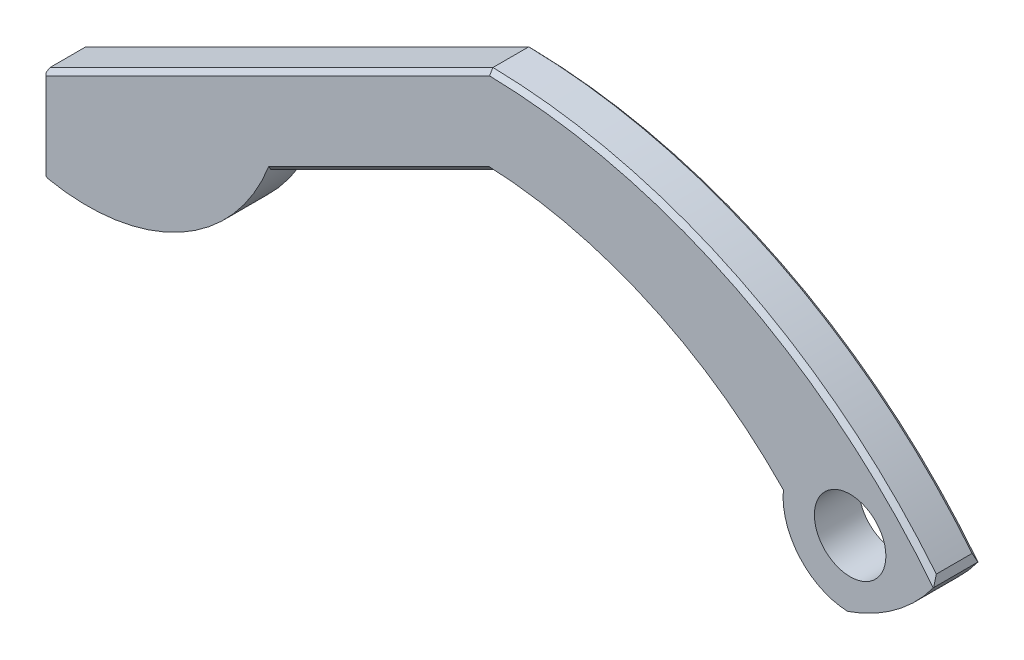
ISO-10303-21;
HEADER;
FILE_DESCRIPTION(('STEP AP214'),'2;1');
FILE_NAME('part.step','',(''),(''),'','','');
FILE_SCHEMA(('AUTOMOTIVE_DESIGN { 1 0 10303 214 1 1 1 1 }'));
ENDSEC;
DATA;
#1=APPLICATION_CONTEXT('core data for automotive mechanical design processes');
#2=APPLICATION_PROTOCOL_DEFINITION('international standard','automotive_design',2000,#1);
#3=PRODUCT_CONTEXT('',#1,'mechanical');
#4=PRODUCT('Part','Part','',(#3));
#5=PRODUCT_RELATED_PRODUCT_CATEGORY('part','',(#4));
#6=PRODUCT_DEFINITION_FORMATION('','',#4);
#7=PRODUCT_DEFINITION_CONTEXT('part definition',#1,'design');
#8=PRODUCT_DEFINITION('design','',#6,#7);
#9=PRODUCT_DEFINITION_SHAPE('','',#8);
#10=(LENGTH_UNIT() NAMED_UNIT(*) SI_UNIT(.MILLI.,.METRE.));
#11=(NAMED_UNIT(*) PLANE_ANGLE_UNIT() SI_UNIT($,.RADIAN.));
#12=(NAMED_UNIT(*) SI_UNIT($,.STERADIAN.) SOLID_ANGLE_UNIT());
#13=UNCERTAINTY_MEASURE_WITH_UNIT(LENGTH_MEASURE(1.E-05),#10,'distance_accuracy_value','');
#14=(GEOMETRIC_REPRESENTATION_CONTEXT(3) GLOBAL_UNCERTAINTY_ASSIGNED_CONTEXT((#13)) GLOBAL_UNIT_ASSIGNED_CONTEXT((#10,
#11,#12)) REPRESENTATION_CONTEXT('',''));
#15=CARTESIAN_POINT('',(0.,0.,0.));
#16=DIRECTION('',(0.,0.,1.));
#17=DIRECTION('',(1.,0.,0.));
#18=AXIS2_PLACEMENT_3D('',#15,#16,#17);
#19=CARTESIAN_POINT('',(-0.215383324910399,-10.8201661968441,1.25));
#20=DIRECTION('',(0.,0.,-1.));
#21=DIRECTION('',(-1.,0.,0.));
#22=AXIS2_PLACEMENT_3D('',#19,#20,#21);
#23=CYLINDRICAL_SURFACE('',#22,14.4871589450677);
#24=DIRECTION('',(0.,0.,-1.));
#25=VECTOR('',#24,1.);
#26=CARTESIAN_POINT('',(10.3071423393507,-0.862544596048978,1.25));
#27=LINE('',#26,#25);
#28=CARTESIAN_POINT('',(10.3071423393507,-0.862544596048978,1.1));
#29=VERTEX_POINT('',#28);
#30=CARTESIAN_POINT('',(10.3071423393507,-0.862544596048978,-0.100000000000005));
#31=VERTEX_POINT('',#30);
#32=EDGE_CURVE('E209',#29,#31,#27,.T.);
#33=ORIENTED_EDGE('',*,*,#32,.F.);
#34=CARTESIAN_POINT('',(-0.215383324910399,-10.8201661968441,1.1));
#35=DIRECTION('',(0.,0.,1.));
#36=DIRECTION('',(1.,0.,0.));
#37=AXIS2_PLACEMENT_3D('',#34,#35,#36);
#38=CIRCLE('',#37,14.4871589450677);
#39=CARTESIAN_POINT('',(0.463234044935415,3.65108989117388,1.1));
#40=VERTEX_POINT('',#39);
#41=EDGE_CURVE('E455',#29,#40,#38,.T.);
#42=ORIENTED_EDGE('',*,*,#41,.T.);
#43=DIRECTION('',(0.,0.,-1.));
#44=VECTOR('',#43,1.);
#45=CARTESIAN_POINT('',(0.463234044935415,3.65108989117388,1.25));
#46=LINE('',#45,#44);
#47=CARTESIAN_POINT('',(0.463234044935415,3.65108989117388,-0.100000000000005));
#48=VERTEX_POINT('',#47);
#49=EDGE_CURVE('E446',#40,#48,#46,.T.);
#50=ORIENTED_EDGE('',*,*,#49,.T.);
#51=CARTESIAN_POINT('',(-0.215383324910399,-10.8201661968441,-0.100000000000005));
#52=DIRECTION('',(0.,0.,1.));
#53=DIRECTION('',(1.,0.,0.));
#54=AXIS2_PLACEMENT_3D('',#51,#52,#53);
#55=CIRCLE('',#54,14.4871589450677);
#56=EDGE_CURVE('E452',#48,#31,#55,.F.);
#57=ORIENTED_EDGE('',*,*,#56,.T.);
#58=EDGE_LOOP('',(#33,#42,#50,#57));
#59=FACE_BOUND('',#58,.T.);
#60=ADVANCED_FACE('F42',(#59),#23,.F.);
#61=CARTESIAN_POINT('',(12.5571423393507,-0.862544596048907,1.25));
#62=DIRECTION('',(0.,0.,-1.));
#63=DIRECTION('',(-1.,0.,0.));
#64=AXIS2_PLACEMENT_3D('',#61,#62,#63);
#65=CYLINDRICAL_SURFACE('',#64,2.25000000000007);
#66=CARTESIAN_POINT('',(12.5571423393507,-0.862544596048907,-0.250000000000001));
#67=DIRECTION('',(0.,0.,1.));
#68=DIRECTION('',(1.,0.,0.));
#69=AXIS2_PLACEMENT_3D('',#66,#67,#68);
#70=CIRCLE('',#69,2.25000000000007);
#71=CARTESIAN_POINT('',(10.3166946776745,-0.655435264318539,-0.250000000000001));
#72=VERTEX_POINT('',#71);
#73=CARTESIAN_POINT('',(12.4754580521979,-3.11106136877546,-0.250000000000001));
#74=VERTEX_POINT('',#73);
#75=EDGE_CURVE('E462',#72,#74,#70,.T.);
#76=ORIENTED_EDGE('',*,*,#75,.T.);
#77=DIRECTION('',(0.,0.,-1.));
#78=VECTOR('',#77,1.);
#79=CARTESIAN_POINT('',(12.4754580521979,-3.11106136877546,0.499999999999999));
#80=LINE('',#79,#78);
#81=CARTESIAN_POINT('',(12.4754580521979,-3.11106136877546,1.25));
#82=VERTEX_POINT('',#81);
#83=EDGE_CURVE('E478',#74,#82,#80,.F.);
#84=ORIENTED_EDGE('',*,*,#83,.T.);
#85=CARTESIAN_POINT('',(12.5571423393507,-0.862544596048907,1.25));
#86=DIRECTION('',(0.,0.,1.));
#87=DIRECTION('',(1.,0.,0.));
#88=AXIS2_PLACEMENT_3D('',#85,#86,#87);
#89=CIRCLE('',#88,2.25000000000007);
#90=CARTESIAN_POINT('',(10.3166946776745,-0.655435264318556,1.25));
#91=VERTEX_POINT('',#90);
#92=EDGE_CURVE('E486',#91,#82,#89,.T.);
#93=ORIENTED_EDGE('',*,*,#92,.F.);
#94=CARTESIAN_POINT('',(10.3166946776745,-0.655435264318556,1.25));
#95=CARTESIAN_POINT('',(10.3135381429341,-0.689302917529493,1.22420137521836));
#96=CARTESIAN_POINT('',(10.3111638473709,-0.723495853963048,1.19880206361833));
#97=CARTESIAN_POINT('',(10.307979734391,-0.792532297787689,1.14880206351342));
#98=CARTESIAN_POINT('',(10.3071699171788,-0.82737580526382,1.12420137511295));
#99=CARTESIAN_POINT('',(10.3071423393484,-0.862544596047611,1.09999999999848));
#100=B_SPLINE_CURVE_WITH_KNOTS('',3,(#94,#95,#96,#97,#98,#99),.UNSPECIFIED.,.F.,.F.,(4,2,4),(0.,
0.127981533434059,0.255963083598142),.UNSPECIFIED.);
#101=EDGE_CURVE('E297',#91,#29,#100,.T.);
#102=ORIENTED_EDGE('',*,*,#101,.T.);
#103=ORIENTED_EDGE('',*,*,#32,.T.);
#104=CARTESIAN_POINT('',(10.3071423393507,-0.862544596048978,-0.100000000000005));
#105=CARTESIAN_POINT('',(10.3071699171801,-0.827375805264603,-0.124201375113738));
#106=CARTESIAN_POINT('',(10.3079797343915,-0.792532297788036,-0.148802063513688));
#107=CARTESIAN_POINT('',(10.3111638473704,-0.723495853962839,-0.198802063617948));
#108=CARTESIAN_POINT('',(10.3135381429334,-0.689302917529164,-0.224201375217859));
#109=CARTESIAN_POINT('',(10.3166946776739,-0.655435264318254,-0.249999999999588));
#110=B_SPLINE_CURVE_WITH_KNOTS('',3,(#104,#105,#106,#107,#108,#109),.UNSPECIFIED.,.F.,.F.,(4,2,
4),(0.,0.127981550164203,0.2559630835983),.UNSPECIFIED.);
#111=EDGE_CURVE('E290',#31,#72,#110,.T.);
#112=ORIENTED_EDGE('',*,*,#111,.T.);
#113=EDGE_LOOP('',(#76,#84,#93,#102,#103,#112));
#114=FACE_BOUND('',#113,.T.);
#115=ADVANCED_FACE('F281',(#114),#65,.T.);
#116=CARTESIAN_POINT('',(0.0449376625318565,-13.0115144706522,1.25));
#117=DIRECTION('',(0.,0.,-1.));
#118=DIRECTION('',(-1.,0.,0.));
#119=AXIS2_PLACEMENT_3D('',#116,#117,#118);
#120=CYLINDRICAL_SURFACE('',#119,19.6109136045686);
#121=CARTESIAN_POINT('',(0.0449376625318565,-13.0115144706522,1.1));
#122=DIRECTION('',(0.,0.,1.));
#123=DIRECTION('',(1.,0.,0.));
#124=AXIS2_PLACEMENT_3D('',#121,#122,#123);
#125=CIRCLE('',#124,19.6109136045686);
#126=CARTESIAN_POINT('',(0.421680848754568,6.59578001322511,1.1));
#127=VERTEX_POINT('',#126);
#128=CARTESIAN_POINT('',(15.3001086391251,-0.688053476241619,1.1));
#129=VERTEX_POINT('',#128);
#130=EDGE_CURVE('E200',#127,#129,#125,.F.);
#131=ORIENTED_EDGE('',*,*,#130,.T.);
#132=DIRECTION('',(0.,0.,-1.));
#133=VECTOR('',#132,1.);
#134=CARTESIAN_POINT('',(15.3001086391251,-0.688053476241619,1.25));
#135=LINE('',#134,#133);
#136=CARTESIAN_POINT('',(15.3001086391251,-0.688053476241619,-0.100000000000007));
#137=VERTEX_POINT('',#136);
#138=EDGE_CURVE('E359',#129,#137,#135,.T.);
#139=ORIENTED_EDGE('',*,*,#138,.T.);
#140=CARTESIAN_POINT('',(0.0449376625318565,-13.0115144706522,-0.100000000000007));
#141=DIRECTION('',(0.,0.,1.));
#142=DIRECTION('',(1.,0.,0.));
#143=AXIS2_PLACEMENT_3D('',#140,#141,#142);
#144=CIRCLE('',#143,19.6109136045686);
#145=CARTESIAN_POINT('',(0.421680848754568,6.59578001322511,-0.100000000000007));
#146=VERTEX_POINT('',#145);
#147=EDGE_CURVE('E207',#137,#146,#144,.T.);
#148=ORIENTED_EDGE('',*,*,#147,.T.);
#149=DIRECTION('',(0.,0.,-1.));
#150=VECTOR('',#149,1.);
#151=CARTESIAN_POINT('',(0.421680848754568,6.59578001322511,1.25));
#152=LINE('',#151,#150);
#153=EDGE_CURVE('E183',#127,#146,#152,.T.);
#154=ORIENTED_EDGE('',*,*,#153,.F.);
#155=EDGE_LOOP('',(#131,#139,#148,#154));
#156=FACE_BOUND('',#155,.T.);
#157=ADVANCED_FACE('F204',(#156),#120,.T.);
#158=CARTESIAN_POINT('',(-2.54744787946072,5.11121564911746,1.25));
#159=DIRECTION('',(0.447213595499958,-0.894427190999916,0.));
#160=DIRECTION('',(0.894427190999916,0.447213595499958,0.));
#161=AXIS2_PLACEMENT_3D('',#158,#159,#160);
#162=PLANE('',#161);
#163=DIRECTION('',(-0.894427190999916,-0.447213595499958,0.));
#164=VECTOR('',#163,1.);
#165=CARTESIAN_POINT('',(-2.54744787946072,5.11121564911746,-0.100000000000003));
#166=LINE('',#165,#164);
#167=CARTESIAN_POINT('',(-14.4441550725954,-0.837137947449899,-0.100000000000003));
#168=VERTEX_POINT('',#167);
#169=EDGE_CURVE('E226',#146,#168,#166,.T.);
#170=ORIENTED_EDGE('',*,*,#169,.T.);
#171=DIRECTION('',(0.,0.,1.));
#172=VECTOR('',#171,1.);
#173=CARTESIAN_POINT('',(-14.4441550725954,-0.837137947449901,1.25));
#174=LINE('',#173,#172);
#175=CARTESIAN_POINT('',(-14.4441550725954,-0.837137947449901,1.1));
#176=VERTEX_POINT('',#175);
#177=EDGE_CURVE('E186',#168,#176,#174,.T.);
#178=ORIENTED_EDGE('',*,*,#177,.T.);
#179=DIRECTION('',(0.894427190999916,0.447213595499958,0.));
#180=VECTOR('',#179,1.);
#181=CARTESIAN_POINT('',(0.421680848754567,6.59578001322511,1.1));
#182=LINE('',#181,#180);
#183=EDGE_CURVE('E178',#176,#127,#182,.T.);
#184=ORIENTED_EDGE('',*,*,#183,.T.);
#185=ORIENTED_EDGE('',*,*,#153,.T.);
#186=EDGE_LOOP('',(#170,#178,#184,#185));
#187=FACE_BOUND('',#186,.T.);
#188=ADVANCED_FACE('F181',(#187),#162,.F.);
#189=CARTESIAN_POINT('',(-14.5783191512454,-0.86254459604898,1.25));
#190=DIRECTION('',(1.,0.,0.));
#191=DIRECTION('',(0.,0.,-1.));
#192=AXIS2_PLACEMENT_3D('',#189,#190,#191);
#193=PLANE('',#192);
#194=DIRECTION('',(0.,1.,0.));
#195=VECTOR('',#194,1.);
#196=CARTESIAN_POINT('',(-14.5783191512454,-1.07192508508737,1.1));
#197=LINE('',#196,#195);
#198=CARTESIAN_POINT('',(-14.5783191512454,-3.75421998677489,1.1));
#199=VERTEX_POINT('',#198);
#200=CARTESIAN_POINT('',(-14.5783191512454,-1.23963018339986,1.1));
#201=VERTEX_POINT('',#200);
#202=EDGE_CURVE('E398',#199,#201,#197,.T.);
#203=ORIENTED_EDGE('',*,*,#202,.T.);
#204=DIRECTION('',(0.,0.,-1.));
#205=VECTOR('',#204,1.);
#206=CARTESIAN_POINT('',(-14.5783191512454,-1.23963018339986,1.25));
#207=LINE('',#206,#205);
#208=CARTESIAN_POINT('',(-14.5783191512454,-1.23963018339986,-0.100000000000002));
#209=VERTEX_POINT('',#208);
#210=EDGE_CURVE('E377',#201,#209,#207,.T.);
#211=ORIENTED_EDGE('',*,*,#210,.T.);
#212=DIRECTION('',(0.,-1.,0.));
#213=VECTOR('',#212,1.);
#214=CARTESIAN_POINT('',(-14.5783191512454,-0.86254459604898,-0.100000000000002));
#215=LINE('',#214,#213);
#216=CARTESIAN_POINT('',(-14.5783191512454,-3.75421998677489,-0.100000000000002));
#217=VERTEX_POINT('',#216);
#218=EDGE_CURVE('E406',#209,#217,#215,.T.);
#219=ORIENTED_EDGE('',*,*,#218,.T.);
#220=DIRECTION('',(0.,0.,1.));
#221=VECTOR('',#220,1.);
#222=CARTESIAN_POINT('',(-14.5783191512454,-3.75421998677489,1.25));
#223=LINE('',#222,#221);
#224=EDGE_CURVE('E386',#217,#199,#223,.T.);
#225=ORIENTED_EDGE('',*,*,#224,.T.);
#226=EDGE_LOOP('',(#203,#211,#219,#225));
#227=FACE_BOUND('',#226,.T.);
#228=ADVANCED_FACE('F485',(#227),#193,.F.);
#229=CARTESIAN_POINT('',(-13.0468668829687,2.43643976611896,1.25));
#230=DIRECTION('',(0.,0.,-1.));
#231=DIRECTION('',(-1.,0.,0.));
#232=AXIS2_PLACEMENT_3D('',#229,#230,#231);
#233=CYLINDRICAL_SURFACE('',#232,6.52298337817734);
#234=CARTESIAN_POINT('',(-13.0468668829687,2.43643976611896,1.25));
#235=DIRECTION('',(0.,0.,1.));
#236=DIRECTION('',(1.,0.,0.));
#237=AXIS2_PLACEMENT_3D('',#234,#235,#236);
#238=CIRCLE('',#237,6.52298337817734);
#239=CARTESIAN_POINT('',(-14.3846507007234,-3.94788843729693,1.25));
#240=VERTEX_POINT('',#239);
#241=CARTESIAN_POINT('',(-6.95250006894324,0.110927932547036,1.25));
#242=VERTEX_POINT('',#241);
#243=EDGE_CURVE('E416',#240,#242,#238,.T.);
#244=ORIENTED_EDGE('',*,*,#243,.F.);
#245=DIRECTION('',(0.,0.,-1.));
#246=VECTOR('',#245,1.);
#247=CARTESIAN_POINT('',(-14.3846507007234,-3.94788843729693,1.25));
#248=LINE('',#247,#246);
#249=CARTESIAN_POINT('',(-14.3846507007234,-3.94788843729693,-0.250000000000001));
#250=VERTEX_POINT('',#249);
#251=EDGE_CURVE('E393',#240,#250,#248,.T.);
#252=ORIENTED_EDGE('',*,*,#251,.T.);
#253=CARTESIAN_POINT('',(-13.0468668829687,2.43643976611896,-0.250000000000001));
#254=DIRECTION('',(0.,0.,1.));
#255=DIRECTION('',(1.,0.,0.));
#256=AXIS2_PLACEMENT_3D('',#253,#254,#255);
#257=CIRCLE('',#256,6.52298337817734);
#258=CARTESIAN_POINT('',(-6.95250006894324,0.110927932547032,-0.250000000000001));
#259=VERTEX_POINT('',#258);
#260=EDGE_CURVE('E466',#250,#259,#257,.T.);
#261=ORIENTED_EDGE('',*,*,#260,.T.);
#262=CARTESIAN_POINT('',(-13.0468668829687,2.43643976611896,-5.0554847121347));
#263=DIRECTION('',(-0.316227766016836,0.632455532033673,0.707106781186551));
#264=DIRECTION('',(-0.316227766016839,0.632455532033679,-0.707106781186544));
#265=AXIS2_PLACEMENT_3D('',#262,#263,#264);
#266=ELLIPSE('',#265,9.22489156055262,6.52298337817734);
#267=CARTESIAN_POINT('',(-7.03676595506459,-0.0989101088261246,-0.100000000000005));
#268=VERTEX_POINT('',#267);
#269=EDGE_CURVE('E425',#259,#268,#266,.F.);
#270=ORIENTED_EDGE('',*,*,#269,.T.);
#271=DIRECTION('',(0.,0.,-1.));
#272=VECTOR('',#271,1.);
#273=CARTESIAN_POINT('',(-7.03676595506459,-0.0989101088261246,1.25));
#274=LINE('',#273,#272);
#275=CARTESIAN_POINT('',(-7.03676595506459,-0.0989101088261246,1.1));
#276=VERTEX_POINT('',#275);
#277=EDGE_CURVE('E210',#276,#268,#274,.T.);
#278=ORIENTED_EDGE('',*,*,#277,.F.);
#279=CARTESIAN_POINT('',(-13.0468668829687,2.43643976611896,6.05548471213471));
#280=DIRECTION('',(0.316227766016837,-0.632455532033674,0.70710678118655));
#281=DIRECTION('',(0.316227766016839,-0.632455532033678,-0.707106781186545));
#282=AXIS2_PLACEMENT_3D('',#279,#280,#281);
#283=ELLIPSE('',#282,9.22489156055263,6.52298337817734);
#284=EDGE_CURVE('E324',#276,#242,#283,.T.);
#285=ORIENTED_EDGE('',*,*,#284,.T.);
#286=EDGE_LOOP('',(#244,#252,#261,#270,#278,#285));
#287=FACE_BOUND('',#286,.T.);
#288=ADVANCED_FACE('F415',(#287),#233,.T.);
#289=CARTESIAN_POINT('',(-1.36126119140406,2.73884227300414,1.25));
#290=DIRECTION('',(-0.447213595499958,0.894427190999916,0.));
#291=DIRECTION('',(-0.894427190999916,-0.447213595499958,0.));
#292=AXIS2_PLACEMENT_3D('',#289,#290,#291);
#293=PLANE('',#292);
#294=ORIENTED_EDGE('',*,*,#49,.F.);
#295=DIRECTION('',(-0.894427190999916,-0.447213595499958,0.));
#296=VECTOR('',#295,1.);
#297=CARTESIAN_POINT('',(-7.03676595506459,-0.0989101088261249,1.1));
#298=LINE('',#297,#296);
#299=EDGE_CURVE('E325',#40,#276,#298,.T.);
#300=ORIENTED_EDGE('',*,*,#299,.T.);
#301=ORIENTED_EDGE('',*,*,#277,.T.);
#302=DIRECTION('',(0.894427190999916,0.447213595499958,0.));
#303=VECTOR('',#302,1.);
#304=CARTESIAN_POINT('',(-1.36126119140406,2.73884227300414,-0.100000000000005));
#305=LINE('',#304,#303);
#306=EDGE_CURVE('E304',#268,#48,#305,.T.);
#307=ORIENTED_EDGE('',*,*,#306,.T.);
#308=EDGE_LOOP('',(#294,#300,#301,#307));
#309=FACE_BOUND('',#308,.T.);
#310=ADVANCED_FACE('F445',(#309),#293,.F.);
#311=CARTESIAN_POINT('',(0.439432243122505,-0.86254459604898,1.25));
#312=DIRECTION('',(0.,0.,1.));
#313=DIRECTION('',(1.,0.,0.));
#314=AXIS2_PLACEMENT_3D('',#311,#312,#313);
#315=PLANE('',#314);
#316=DIRECTION('',(0.,-1.,0.));
#317=VECTOR('',#316,1.);
#318=CARTESIAN_POINT('',(-14.4283191512454,-3.90421998677489,1.25));
#319=LINE('',#318,#317);
#320=CARTESIAN_POINT('',(-14.4283191512454,-0.99692508508737,1.25));
#321=VERTEX_POINT('',#320);
#322=CARTESIAN_POINT('',(-14.4283191512454,-3.9042199867749,1.25));
#323=VERTEX_POINT('',#322);
#324=EDGE_CURVE('E401',#321,#323,#319,.T.);
#325=ORIENTED_EDGE('',*,*,#324,.T.);
#326=DIRECTION('',(-0.70710678118654,0.707106781186555,0.));
#327=VECTOR('',#326,1.);
#328=CARTESIAN_POINT('',(-8.51528114942457,-9.81725798859588,1.25));
#329=LINE('',#328,#327);
#330=EDGE_CURVE('E382',#323,#240,#329,.F.);
#331=ORIENTED_EDGE('',*,*,#330,.T.);
#332=ORIENTED_EDGE('',*,*,#243,.T.);
#333=DIRECTION('',(0.894427190999916,0.447213595499958,0.));
#334=VECTOR('',#333,1.);
#335=CARTESIAN_POINT('',(0.666384083341939,3.92037000868962,1.25));
#336=LINE('',#335,#334);
#337=CARTESIAN_POINT('',(0.431065290268795,3.80271061215305,1.25));
#338=VERTEX_POINT('',#337);
#339=EDGE_CURVE('E422',#242,#338,#336,.T.);
#340=ORIENTED_EDGE('',*,*,#339,.T.);
#341=CARTESIAN_POINT('',(-0.215383324910399,-10.8201661968441,1.25));
#342=DIRECTION('',(0.,0.,1.));
#343=DIRECTION('',(1.,0.,0.));
#344=AXIS2_PLACEMENT_3D('',#341,#342,#343);
#345=CIRCLE('',#344,14.6371589450677);
#346=EDGE_CURVE('E305',#338,#91,#345,.F.);
#347=ORIENTED_EDGE('',*,*,#346,.T.);
#348=ORIENTED_EDGE('',*,*,#92,.T.);
#349=CARTESIAN_POINT('',(10.5098202208637,2.55782458139393,1.25));
#350=DIRECTION('',(0.,0.,1.));
#351=DIRECTION('',(1.,0.,0.));
#352=AXIS2_PLACEMENT_3D('',#349,#350,#351);
#353=CIRCLE('',#352,6.);
#354=CARTESIAN_POINT('',(15.3486850193325,-0.98976438326071,1.25));
#355=VERTEX_POINT('',#354);
#356=EDGE_CURVE('E268',#82,#355,#353,.T.);
#357=ORIENTED_EDGE('',*,*,#356,.T.);
#358=CARTESIAN_POINT('',(0.0449376625318565,-13.0115144706522,1.25));
#359=DIRECTION('',(0.,0.,1.));
#360=DIRECTION('',(1.,0.,0.));
#361=AXIS2_PLACEMENT_3D('',#358,#359,#360);
#362=CIRCLE('',#361,19.4609136045686);
#363=CARTESIAN_POINT('',(0.455660030232675,6.44506450565168,1.25));
#364=VERTEX_POINT('',#363);
#365=EDGE_CURVE('E189',#355,#364,#362,.T.);
#366=ORIENTED_EDGE('',*,*,#365,.T.);
#367=DIRECTION('',(-0.894427190999916,-0.447213595499958,0.));
#368=VECTOR('',#367,1.);
#369=CARTESIAN_POINT('',(-14.5112371119204,-1.03838406542488,1.25));
#370=LINE('',#369,#368);
#371=EDGE_CURVE('E190',#364,#321,#370,.T.);
#372=ORIENTED_EDGE('',*,*,#371,.T.);
#373=EDGE_LOOP('',(#325,#331,#332,#340,#347,#348,#357,#366,#372));
#374=FACE_BOUND('',#373,.T.);
#375=CARTESIAN_POINT('',(12.5571423393507,-0.862544596048907,1.25));
#376=DIRECTION('',(0.,0.,1.));
#377=DIRECTION('',(1.,0.,0.));
#378=AXIS2_PLACEMENT_3D('',#375,#376,#377);
#379=CIRCLE('',#378,1.2);
#380=CARTESIAN_POINT('',(13.7571423393507,-0.862544596048907,1.25));
#381=VERTEX_POINT('',#380);
#382=EDGE_CURVE('E491',#381,#381,#379,.T.);
#383=ORIENTED_EDGE('',*,*,#382,.F.);
#384=EDGE_LOOP('',(#383));
#385=FACE_BOUND('',#384,.T.);
#386=ADVANCED_FACE('F473',(#374,#385),#315,.T.);
#387=CARTESIAN_POINT('',(0.439432243122505,-0.86254459604898,-0.250000000000001));
#388=DIRECTION('',(0.,0.,1.));
#389=DIRECTION('',(1.,0.,0.));
#390=AXIS2_PLACEMENT_3D('',#387,#388,#389);
#391=PLANE('',#390);
#392=ORIENTED_EDGE('',*,*,#260,.F.);
#393=DIRECTION('',(0.70710678118654,-0.707106781186555,0.));
#394=VECTOR('',#393,1.);
#395=CARTESIAN_POINT('',(-14.3846507007234,-3.94788843729693,-0.250000000000001));
#396=LINE('',#395,#394);
#397=CARTESIAN_POINT('',(-14.4283191512454,-3.90421998677489,-0.250000000000001));
#398=VERTEX_POINT('',#397);
#399=EDGE_CURVE('E391',#250,#398,#396,.F.);
#400=ORIENTED_EDGE('',*,*,#399,.T.);
#401=DIRECTION('',(0.,1.,0.));
#402=VECTOR('',#401,1.);
#403=CARTESIAN_POINT('',(-14.4283191512454,-0.86254459604898,-0.250000000000001));
#404=LINE('',#403,#402);
#405=CARTESIAN_POINT('',(-14.4283191512454,-0.996925085087383,-0.250000000000001));
#406=VERTEX_POINT('',#405);
#407=EDGE_CURVE('E405',#398,#406,#404,.T.);
#408=ORIENTED_EDGE('',*,*,#407,.T.);
#409=DIRECTION('',(0.894427190999916,0.447213595499958,0.));
#410=VECTOR('',#409,1.);
#411=CARTESIAN_POINT('',(-2.48036584013572,4.97705157046747,-0.250000000000001));
#412=LINE('',#411,#410);
#413=CARTESIAN_POINT('',(0.455660030232706,6.44506450565169,-0.250000000000001));
#414=VERTEX_POINT('',#413);
#415=EDGE_CURVE('E228',#406,#414,#412,.T.);
#416=ORIENTED_EDGE('',*,*,#415,.T.);
#417=CARTESIAN_POINT('',(0.0449376625318565,-13.0115144706522,-0.250000000000001));
#418=DIRECTION('',(0.,0.,1.));
#419=DIRECTION('',(1.,0.,0.));
#420=AXIS2_PLACEMENT_3D('',#417,#418,#419);
#421=CIRCLE('',#420,19.4609136045686);
#422=CARTESIAN_POINT('',(15.3486850193325,-0.989764383260699,-0.250000000000001));
#423=VERTEX_POINT('',#422);
#424=EDGE_CURVE('E215',#414,#423,#421,.F.);
#425=ORIENTED_EDGE('',*,*,#424,.T.);
#426=CARTESIAN_POINT('',(10.5098202208637,2.55782458139393,-0.250000000000001));
#427=DIRECTION('',(0.,0.,1.));
#428=DIRECTION('',(1.,0.,0.));
#429=AXIS2_PLACEMENT_3D('',#426,#427,#428);
#430=CIRCLE('',#429,6.);
#431=EDGE_CURVE('E464',#423,#74,#430,.F.);
#432=ORIENTED_EDGE('',*,*,#431,.T.);
#433=ORIENTED_EDGE('',*,*,#75,.F.);
#434=CARTESIAN_POINT('',(-0.215383324910399,-10.8201661968441,-0.250000000000001));
#435=DIRECTION('',(0.,0.,1.));
#436=DIRECTION('',(1.,0.,0.));
#437=AXIS2_PLACEMENT_3D('',#434,#435,#436);
#438=CIRCLE('',#437,14.6371589450677);
#439=CARTESIAN_POINT('',(0.431065290268817,3.80271061215306,-0.250000000000001));
#440=VERTEX_POINT('',#439);
#441=EDGE_CURVE('E267',#72,#440,#438,.T.);
#442=ORIENTED_EDGE('',*,*,#441,.T.);
#443=DIRECTION('',(-0.894427190999916,-0.447213595499958,0.));
#444=VECTOR('',#443,1.);
#445=CARTESIAN_POINT('',(-1.42834323072905,2.87300635165413,-0.250000000000001));
#446=LINE('',#445,#444);
#447=EDGE_CURVE('E434',#440,#259,#446,.T.);
#448=ORIENTED_EDGE('',*,*,#447,.T.);
#449=EDGE_LOOP('',(#392,#400,#408,#416,#425,#432,#433,#442,#448));
#450=FACE_BOUND('',#449,.T.);
#451=CARTESIAN_POINT('',(12.5571423393507,-0.862544596048907,-0.250000000000001));
#452=DIRECTION('',(0.,0.,1.));
#453=DIRECTION('',(1.,0.,0.));
#454=AXIS2_PLACEMENT_3D('',#451,#452,#453);
#455=CIRCLE('',#454,1.2);
#456=CARTESIAN_POINT('',(13.7571423393507,-0.862544596048907,-0.250000000000001));
#457=VERTEX_POINT('',#456);
#458=EDGE_CURVE('E467',#457,#457,#455,.T.);
#459=ORIENTED_EDGE('',*,*,#458,.T.);
#460=EDGE_LOOP('',(#459));
#461=FACE_BOUND('',#460,.T.);
#462=ADVANCED_FACE('F278',(#450,#461),#391,.F.);
#463=CARTESIAN_POINT('',(-2.48036584013573,4.97705157046748,1.25));
#464=DIRECTION('',(-0.316227766016842,0.632455532033683,0.70710678118654));
#465=DIRECTION('',(0.894427190999916,0.447213595499958,0.));
#466=AXIS2_PLACEMENT_3D('',#463,#464,#465);
#467=PLANE('',#466);
#468=ORIENTED_EDGE('',*,*,#183,.F.);
#469=DIRECTION('',(0.258198889747161,0.774596669241478,-0.577350269189634));
#470=VECTOR('',#469,1.);
#471=CARTESIAN_POINT('',(-12.5060918999563,4.97705157046741,-3.23364099871004));
#472=LINE('',#471,#470);
#473=CARTESIAN_POINT('',(-14.4856140529329,-0.961514888462405,1.19270509831248));
#474=VERTEX_POINT('',#473);
#475=EDGE_CURVE('E353',#176,#474,#472,.F.);
#476=ORIENTED_EDGE('',*,*,#475,.T.);
#477=DIRECTION('',(0.647936163294311,-0.400446571456057,0.6479361632943));
#478=VECTOR('',#477,1.);
#479=CARTESIAN_POINT('',(-10.9623449723586,-3.1390149317688,4.71597417888679));
#480=LINE('',#479,#478);
#481=EDGE_CURVE('E396',#474,#321,#480,.T.);
#482=ORIENTED_EDGE('',*,*,#481,.T.);
#483=ORIENTED_EDGE('',*,*,#371,.F.);
#484=CARTESIAN_POINT('',(0.455660030232675,6.44506450565168,1.25));
#485=CARTESIAN_POINT('',(0.450008409135022,6.47018786344514,1.22500150386883));
#486=CARTESIAN_POINT('',(0.444351000129363,6.49530916797442,1.20000225580181));
#487=CARTESIAN_POINT('',(0.433024606303323,6.54554767049889,1.15000225580181));
#488=CARTESIAN_POINT('',(0.427355621482946,6.57066486849409,1.12500150386882));
#489=CARTESIAN_POINT('',(0.421680848754564,6.59578001322511,1.1));
#490=B_SPLINE_CURVE_WITH_KNOTS('',3,(#484,#485,#486,#487,#488,#489),.UNSPECIFIED.,.F.,.F.,(4,2,
4),(0.,0.107668182841708,0.215336365658846),.UNSPECIFIED.);
#491=EDGE_CURVE('E194',#364,#127,#490,.T.);
#492=ORIENTED_EDGE('',*,*,#491,.T.);
#493=EDGE_LOOP('',(#468,#476,#482,#483,#492));
#494=FACE_BOUND('',#493,.T.);
#495=ADVANCED_FACE('F195',(#494),#467,.T.);
#496=CARTESIAN_POINT('',(0.0449376625318565,-13.0115144706522,1.25));
#497=DIRECTION('',(0.,0.,-1.));
#498=DIRECTION('',(-1.,0.,0.));
#499=AXIS2_PLACEMENT_3D('',#496,#497,#498);
#500=CONICAL_SURFACE('',#499,19.4609136045686,0.785398163397448);
#501=CARTESIAN_POINT('',(15.3486850193325,-0.98976438326071,1.25));
#502=CARTESIAN_POINT('',(15.3640604697951,-0.96879340222842,1.22495476251143));
#503=CARTESIAN_POINT('',(15.3793104636735,-0.947706262780887,1.19993214377055));
#504=CARTESIAN_POINT('',(15.4095595382703,-0.905299667043772,1.14993214377053));
#505=CARTESIAN_POINT('',(15.4245586189885,-0.883980210754062,1.12495476251141));
#506=CARTESIAN_POINT('',(15.4394322431225,-0.862544596048983,1.1));
#507=B_SPLINE_CURVE_WITH_KNOTS('',3,(#501,#502,#503,#504,#505,#506),.UNSPECIFIED.,.F.,.F.,(4,2,
4),(0.,0.1083062828658,0.21661256579067),.UNSPECIFIED.);
#508=CARTESIAN_POINT('',(15.3534627417278,-0.983238412973406,1.24221141309982));
#509=VERTEX_POINT('',#508);
#510=EDGE_CURVE('E260',#355,#509,#507,.T.);
#511=ORIENTED_EDGE('',*,*,#510,.T.);
#512=CARTESIAN_POINT('',(15.3534627417278,-0.983238412973338,1.24221141309991));
#513=CARTESIAN_POINT('',(15.3445499083153,-0.933927600146743,1.21875241553245));
#514=CARTESIAN_POINT('',(15.3356473162969,-0.884673448478732,1.19517196539994));
#515=CARTESIAN_POINT('',(15.3178626154302,-0.786278469573027,1.14776816102287));
#516=CARTESIAN_POINT('',(15.308980506581,-0.737137642330465,1.12394480678874));
#517=CARTESIAN_POINT('',(15.3001086391251,-0.688053476241619,1.1));
#518=B_SPLINE_CURVE_WITH_KNOTS('',3,(#512,#513,#514,#515,#516,#517),.UNSPECIFIED.,.F.,.F.,(4,2,
4),(0.,0.165986105041063,0.331972202952624),.UNSPECIFIED.);
#519=EDGE_CURVE('E11',#509,#129,#518,.T.);
#520=ORIENTED_EDGE('',*,*,#519,.T.);
#521=ORIENTED_EDGE('',*,*,#130,.F.);
#522=ORIENTED_EDGE('',*,*,#491,.F.);
#523=ORIENTED_EDGE('',*,*,#365,.F.);
#524=EDGE_LOOP('',(#511,#520,#521,#522,#523));
#525=FACE_BOUND('',#524,.T.);
#526=ADVANCED_FACE('F212',(#525),#500,.T.);
#527=CARTESIAN_POINT('',(0.0449376625318565,-13.0115144706522,-0.100000000000007));
#528=DIRECTION('',(0.,0.,1.));
#529=DIRECTION('',(1.,0.,0.));
#530=AXIS2_PLACEMENT_3D('',#527,#528,#529);
#531=CONICAL_SURFACE('',#530,19.6109136045686,0.785398163397457);
#532=ORIENTED_EDGE('',*,*,#147,.F.);
#533=CARTESIAN_POINT('',(15.3001086391251,-0.688053476241619,-0.100000000000007));
#534=CARTESIAN_POINT('',(15.308980506581,-0.737137642330443,-0.12394480678877));
#535=CARTESIAN_POINT('',(15.3178626154302,-0.786278469572995,-0.147768161022891));
#536=CARTESIAN_POINT('',(15.3356473162969,-0.8846734484787,-0.195171965399904));
#537=CARTESIAN_POINT('',(15.3445499083153,-0.933927600146722,-0.218752415532362));
#538=CARTESIAN_POINT('',(15.3534627417278,-0.983238412973338,-0.242211413099745));
#539=B_SPLINE_CURVE_WITH_KNOTS('',3,(#533,#534,#535,#536,#537,#538),.UNSPECIFIED.,.F.,.F.,(4,2,
4),(0.,0.165986097911524,0.33197220295255),.UNSPECIFIED.);
#540=CARTESIAN_POINT('',(15.3534627417278,-0.983238412973338,-0.242211413099744));
#541=VERTEX_POINT('',#540);
#542=EDGE_CURVE('E70',#137,#541,#539,.T.);
#543=ORIENTED_EDGE('',*,*,#542,.T.);
#544=CARTESIAN_POINT('',(15.4394322431225,-0.86254459604898,-0.100000000000007));
#545=CARTESIAN_POINT('',(15.4245586189885,-0.88398021075406,-0.124954762511414));
#546=CARTESIAN_POINT('',(15.4095595382703,-0.905299667043769,-0.149932143770531));
#547=CARTESIAN_POINT('',(15.3793104636735,-0.947706262780884,-0.199932143770554));
#548=CARTESIAN_POINT('',(15.3640604697951,-0.968793402228415,-0.224954762511434));
#549=CARTESIAN_POINT('',(15.3486850193325,-0.989764383260703,-0.25));
#550=B_SPLINE_CURVE_WITH_KNOTS('',3,(#544,#545,#546,#547,#548,#549),.UNSPECIFIED.,.F.,.F.,(4,2,
4),(0.,0.108306282924864,0.216612565790659),.UNSPECIFIED.);
#551=EDGE_CURVE('E238',#541,#423,#550,.T.);
#552=ORIENTED_EDGE('',*,*,#551,.T.);
#553=ORIENTED_EDGE('',*,*,#424,.F.);
#554=CARTESIAN_POINT('',(0.455660030232706,6.44506450565169,-0.250000000000001));
#555=CARTESIAN_POINT('',(0.450008409135048,6.47018786344514,-0.225001503868829));
#556=CARTESIAN_POINT('',(0.444351000129385,6.49530916797442,-0.200002255801817));
#557=CARTESIAN_POINT('',(0.43302460630334,6.54554767049889,-0.150002255801818));
#558=CARTESIAN_POINT('',(0.427355621482962,6.57066486849409,-0.125001503868831));
#559=CARTESIAN_POINT('',(0.42168084875458,6.59578001322511,-0.100000000000004));
#560=B_SPLINE_CURVE_WITH_KNOTS('',3,(#554,#555,#556,#557,#558,#559),.UNSPECIFIED.,.F.,.F.,(4,2,
4),(0.,0.107668182841707,0.215336365658844),.UNSPECIFIED.);
#561=EDGE_CURVE('E230',#414,#146,#560,.T.);
#562=ORIENTED_EDGE('',*,*,#561,.T.);
#563=EDGE_LOOP('',(#532,#543,#552,#553,#562));
#564=FACE_BOUND('',#563,.T.);
#565=ADVANCED_FACE('F245',(#564),#531,.T.);
#566=CARTESIAN_POINT('',(-2.54744787946072,5.11121564911746,-0.100000000000002));
#567=DIRECTION('',(0.316227766016833,-0.632455532033666,0.707106781186558));
#568=DIRECTION('',(-0.894427190999916,-0.447213595499958,0.));
#569=AXIS2_PLACEMENT_3D('',#566,#567,#568);
#570=PLANE('',#569);
#571=DIRECTION('',(-0.647936163294293,0.400446571456097,0.647936163294293));
#572=VECTOR('',#571,1.);
#573=CARTESIAN_POINT('',(-11.0882913538703,-3.06117578723475,-3.5900277973751));
#574=LINE('',#573,#572);
#575=CARTESIAN_POINT('',(-14.4856140529329,-0.96151488846241,-0.192705098312484));
#576=VERTEX_POINT('',#575);
#577=EDGE_CURVE('E375',#406,#576,#574,.T.);
#578=ORIENTED_EDGE('',*,*,#577,.T.);
#579=DIRECTION('',(0.258198889747166,0.774596669241491,0.577350269189613));
#580=VECTOR('',#579,1.);
#581=CARTESIAN_POINT('',(-12.4613705404063,5.1112156491176,4.33364099870995));
#582=LINE('',#581,#580);
#583=EDGE_CURVE('E361',#576,#168,#582,.T.);
#584=ORIENTED_EDGE('',*,*,#583,.T.);
#585=ORIENTED_EDGE('',*,*,#169,.F.);
#586=ORIENTED_EDGE('',*,*,#561,.F.);
#587=ORIENTED_EDGE('',*,*,#415,.F.);
#588=EDGE_LOOP('',(#578,#584,#585,#586,#587));
#589=FACE_BOUND('',#588,.T.);
#590=ADVANCED_FACE('F247',(#589),#570,.F.);
#591=CARTESIAN_POINT('',(10.5098202208637,2.55782458139393,1.25));
#592=DIRECTION('',(0.,0.,-1.));
#593=DIRECTION('',(-1.,0.,0.));
#594=AXIS2_PLACEMENT_3D('',#591,#592,#593);
#595=CYLINDRICAL_SURFACE('',#594,6.);
#596=ORIENTED_EDGE('',*,*,#551,.F.);
#597=DIRECTION('',(0.,0.,-1.));
#598=VECTOR('',#597,1.);
#599=CARTESIAN_POINT('',(15.3534627417278,-0.983238412973338,1.25));
#600=LINE('',#599,#598);
#601=EDGE_CURVE('E56',#541,#509,#600,.F.);
#602=ORIENTED_EDGE('',*,*,#601,.T.);
#603=ORIENTED_EDGE('',*,*,#510,.F.);
#604=ORIENTED_EDGE('',*,*,#356,.F.);
#605=ORIENTED_EDGE('',*,*,#83,.F.);
#606=ORIENTED_EDGE('',*,*,#431,.F.);
#607=EDGE_LOOP('',(#596,#602,#603,#604,#605,#606));
#608=FACE_BOUND('',#607,.T.);
#609=ADVANCED_FACE('F250',(#608),#595,.T.);
#610=CARTESIAN_POINT('',(-0.215383324910399,-10.8201661968441,-0.250000000000001));
#611=DIRECTION('',(0.,0.,-1.));
#612=DIRECTION('',(-1.,0.,0.));
#613=AXIS2_PLACEMENT_3D('',#610,#611,#612);
#614=CONICAL_SURFACE('',#613,14.6371589450677,0.785398163397457);
#615=ORIENTED_EDGE('',*,*,#111,.F.);
#616=ORIENTED_EDGE('',*,*,#56,.F.);
#617=CARTESIAN_POINT('',(0.463234044935415,3.65108989117388,-0.100000000000005));
#618=CARTESIAN_POINT('',(0.457889068062014,3.67636573549585,-0.124997748762477));
#619=CARTESIAN_POINT('',(0.452535850068935,3.70163871774233,-0.149996623147568));
#620=CARTESIAN_POINT('',(0.441812931846725,3.75217895806873,-0.199996623147569));
#621=CARTESIAN_POINT('',(0.436443231617605,3.77744621614864,-0.224997748762477));
#622=CARTESIAN_POINT('',(0.431065290268816,3.80271061215306,-0.250000000000001));
#623=B_SPLINE_CURVE_WITH_KNOTS('',3,(#617,#618,#619,#620,#621,#622),.UNSPECIFIED.,.F.,.F.,(4,2,
4),(0.,0.107846736878339,0.215693473690166),.UNSPECIFIED.);
#624=EDGE_CURVE('E426',#48,#440,#623,.T.);
#625=ORIENTED_EDGE('',*,*,#624,.T.);
#626=ORIENTED_EDGE('',*,*,#441,.F.);
#627=EDGE_LOOP('',(#615,#616,#625,#626));
#628=FACE_BOUND('',#627,.T.);
#629=ADVANCED_FACE('F255',(#628),#614,.F.);
#630=CARTESIAN_POINT('',(-0.215383324910399,-10.8201661968441,1.1));
#631=DIRECTION('',(0.,0.,1.));
#632=DIRECTION('',(1.,0.,0.));
#633=AXIS2_PLACEMENT_3D('',#630,#631,#632);
#634=CONICAL_SURFACE('',#633,14.4871589450677,0.78539816339744);
#635=ORIENTED_EDGE('',*,*,#101,.F.);
#636=ORIENTED_EDGE('',*,*,#346,.F.);
#637=CARTESIAN_POINT('',(0.431065290268795,3.80271061215305,1.25));
#638=CARTESIAN_POINT('',(0.436443231617587,3.77744621614863,1.22499774876247));
#639=CARTESIAN_POINT('',(0.44181293184671,3.75217895806872,1.19999662314757));
#640=CARTESIAN_POINT('',(0.452535850068925,3.70163871774233,1.14999662314756));
#641=CARTESIAN_POINT('',(0.457889068062007,3.67636573549585,1.12499774876247));
#642=CARTESIAN_POINT('',(0.463234044935409,3.65108989117388,1.1));
#643=B_SPLINE_CURVE_WITH_KNOTS('',3,(#637,#638,#639,#640,#641,#642),.UNSPECIFIED.,.F.,.F.,(4,2,
4),(0.,0.107846736811826,0.215693473690164),.UNSPECIFIED.);
#644=EDGE_CURVE('E317',#338,#40,#643,.T.);
#645=ORIENTED_EDGE('',*,*,#644,.T.);
#646=ORIENTED_EDGE('',*,*,#41,.F.);
#647=EDGE_LOOP('',(#635,#636,#645,#646));
#648=FACE_BOUND('',#647,.T.);
#649=ADVANCED_FACE('F307',(#648),#634,.F.);
#650=CARTESIAN_POINT('',(-1.36126119140406,2.73884227300414,-0.100000000000005));
#651=DIRECTION('',(-0.316227766016836,0.632455532033673,0.707106781186551));
#652=DIRECTION('',(0.894427190999916,0.447213595499958,0.));
#653=AXIS2_PLACEMENT_3D('',#650,#651,#652);
#654=PLANE('',#653);
#655=ORIENTED_EDGE('',*,*,#269,.F.);
#656=ORIENTED_EDGE('',*,*,#447,.F.);
#657=ORIENTED_EDGE('',*,*,#624,.F.);
#658=ORIENTED_EDGE('',*,*,#306,.F.);
#659=EDGE_LOOP('',(#655,#656,#657,#658));
#660=FACE_BOUND('',#659,.T.);
#661=ADVANCED_FACE('F311',(#660),#654,.F.);
#662=CARTESIAN_POINT('',(-1.42834323072905,2.87300635165413,1.25));
#663=DIRECTION('',(0.316227766016837,-0.632455532033674,0.70710678118655));
#664=DIRECTION('',(-0.894427190999916,-0.447213595499958,0.));
#665=AXIS2_PLACEMENT_3D('',#662,#663,#664);
#666=PLANE('',#665);
#667=ORIENTED_EDGE('',*,*,#284,.F.);
#668=ORIENTED_EDGE('',*,*,#299,.F.);
#669=ORIENTED_EDGE('',*,*,#644,.F.);
#670=ORIENTED_EDGE('',*,*,#339,.F.);
#671=EDGE_LOOP('',(#667,#668,#669,#670));
#672=FACE_BOUND('',#671,.T.);
#673=ADVANCED_FACE('F328',(#672),#666,.T.);
#674=CARTESIAN_POINT('',(-14.5783191512454,-0.86254459604898,-0.100000000000002));
#675=DIRECTION('',(0.707106781186548,0.,0.707106781186548));
#676=DIRECTION('',(0.,-1.,0.));
#677=AXIS2_PLACEMENT_3D('',#674,#675,#676);
#678=PLANE('',#677);
#679=ORIENTED_EDGE('',*,*,#218,.F.);
#680=DIRECTION('',(0.301511344577766,0.90453403373329,-0.301511344577766));
#681=VECTOR('',#680,1.);
#682=CARTESIAN_POINT('',(-14.4754776274225,-0.931105611930959,-0.20284152382297));
#683=LINE('',#682,#681);
#684=EDGE_CURVE('E376',#209,#576,#683,.T.);
#685=ORIENTED_EDGE('',*,*,#684,.T.);
#686=ORIENTED_EDGE('',*,*,#577,.F.);
#687=ORIENTED_EDGE('',*,*,#407,.F.);
#688=DIRECTION('',(-0.577350269189622,0.577350269189634,0.577350269189622));
#689=VECTOR('',#688,1.);
#690=CARTESIAN_POINT('',(-15.5422109481541,-2.79032818986623,0.863891796908641));
#691=LINE('',#690,#689);
#692=EDGE_CURVE('E388',#398,#217,#691,.T.);
#693=ORIENTED_EDGE('',*,*,#692,.T.);
#694=EDGE_LOOP('',(#679,#685,#686,#687,#693));
#695=FACE_BOUND('',#694,.T.);
#696=ADVANCED_FACE('F332',(#695),#678,.F.);
#697=CARTESIAN_POINT('',(-14.4283191512454,-0.86254459604898,1.25));
#698=DIRECTION('',(-0.707106781186541,0.,0.707106781186554));
#699=DIRECTION('',(0.,1.,0.));
#700=AXIS2_PLACEMENT_3D('',#697,#698,#699);
#701=PLANE('',#700);
#702=ORIENTED_EDGE('',*,*,#481,.F.);
#703=DIRECTION('',(0.301511344577766,0.904534033733291,0.301511344577761));
#704=VECTOR('',#703,1.);
#705=CARTESIAN_POINT('',(-14.4482049001497,-0.849287430112774,1.23011425109569));
#706=LINE('',#705,#704);
#707=EDGE_CURVE('E356',#474,#201,#706,.F.);
#708=ORIENTED_EDGE('',*,*,#707,.T.);
#709=ORIENTED_EDGE('',*,*,#202,.F.);
#710=DIRECTION('',(-0.577350269189625,0.577350269189637,-0.577350269189615));
#711=VECTOR('',#710,1.);
#712=CARTESIAN_POINT('',(-15.4422109481541,-2.89032818986622,0.236108203091359));
#713=LINE('',#712,#711);
#714=EDGE_CURVE('E384',#199,#323,#713,.F.);
#715=ORIENTED_EDGE('',*,*,#714,.T.);
#716=ORIENTED_EDGE('',*,*,#324,.F.);
#717=EDGE_LOOP('',(#702,#708,#709,#715,#716));
#718=FACE_BOUND('',#717,.T.);
#719=ADVANCED_FACE('F336',(#718),#701,.T.);
#720=CARTESIAN_POINT('',(-14.3846507007234,-3.94788843729693,1.25));
#721=DIRECTION('',(0.707106781186555,0.70710678118654,0.));
#722=DIRECTION('',(0.,0.,-1.));
#723=AXIS2_PLACEMENT_3D('',#720,#721,#722);
#724=PLANE('',#723);
#725=ORIENTED_EDGE('',*,*,#714,.F.);
#726=ORIENTED_EDGE('',*,*,#224,.F.);
#727=ORIENTED_EDGE('',*,*,#692,.F.);
#728=ORIENTED_EDGE('',*,*,#399,.F.);
#729=ORIENTED_EDGE('',*,*,#251,.F.);
#730=ORIENTED_EDGE('',*,*,#330,.F.);
#731=EDGE_LOOP('',(#725,#726,#727,#728,#729,#730));
#732=FACE_BOUND('',#731,.T.);
#733=ADVANCED_FACE('F340',(#732),#724,.F.);
#734=CARTESIAN_POINT('',(-14.5783191512454,-1.23963018339986,1.25));
#735=DIRECTION('',(0.948683298050513,-0.31622776601684,0.));
#736=DIRECTION('',(0.,0.,-1.));
#737=AXIS2_PLACEMENT_3D('',#734,#735,#736);
#738=PLANE('',#737);
#739=ORIENTED_EDGE('',*,*,#475,.F.);
#740=ORIENTED_EDGE('',*,*,#177,.F.);
#741=ORIENTED_EDGE('',*,*,#583,.F.);
#742=ORIENTED_EDGE('',*,*,#684,.F.);
#743=ORIENTED_EDGE('',*,*,#210,.F.);
#744=ORIENTED_EDGE('',*,*,#707,.F.);
#745=EDGE_LOOP('',(#739,#740,#741,#742,#743,#744));
#746=FACE_BOUND('',#745,.T.);
#747=ADVANCED_FACE('F343',(#746),#738,.F.);
#748=CARTESIAN_POINT('',(15.3001086391251,-0.688053476241621,1.25));
#749=DIRECTION('',(-0.984054721514882,-0.177865975004405,0.));
#750=DIRECTION('',(0.,0.,-1.));
#751=AXIS2_PLACEMENT_3D('',#748,#749,#750);
#752=PLANE('',#751);
#753=ORIENTED_EDGE('',*,*,#519,.F.);
#754=ORIENTED_EDGE('',*,*,#601,.F.);
#755=ORIENTED_EDGE('',*,*,#542,.F.);
#756=ORIENTED_EDGE('',*,*,#138,.F.);
#757=EDGE_LOOP('',(#753,#754,#755,#756));
#758=FACE_BOUND('',#757,.T.);
#759=ADVANCED_FACE('F44',(#758),#752,.F.);
#760=CARTESIAN_POINT('',(12.5571423393507,-0.862544596048907,-0.250000000000001));
#761=DIRECTION('',(0.,0.,1.));
#762=DIRECTION('',(1.,0.,0.));
#763=AXIS2_PLACEMENT_3D('',#760,#761,#762);
#764=CYLINDRICAL_SURFACE('',#763,1.2);
#765=ORIENTED_EDGE('',*,*,#458,.F.);
#766=EDGE_LOOP('',(#765));
#767=FACE_BOUND('',#766,.T.);
#768=ORIENTED_EDGE('',*,*,#382,.T.);
#769=EDGE_LOOP('',(#768));
#770=FACE_BOUND('',#769,.T.);
#771=ADVANCED_FACE('F350',(#767,#770),#764,.F.);
#772=CLOSED_SHELL('',(#60,#115,#157,#188,#228,#288,#310,#386,#462,#495,#526,#565,#590,#609,#629,
#649,#661,#673,#696,#719,#733,#747,#759,#771));
#773=MANIFOLD_SOLID_BREP('B2',#772);
#774=ADVANCED_BREP_SHAPE_REPRESENTATION('',(#18,#773),#14);
#775=SHAPE_DEFINITION_REPRESENTATION(#9,#774);
ENDSEC;
END-ISO-10303-21;
